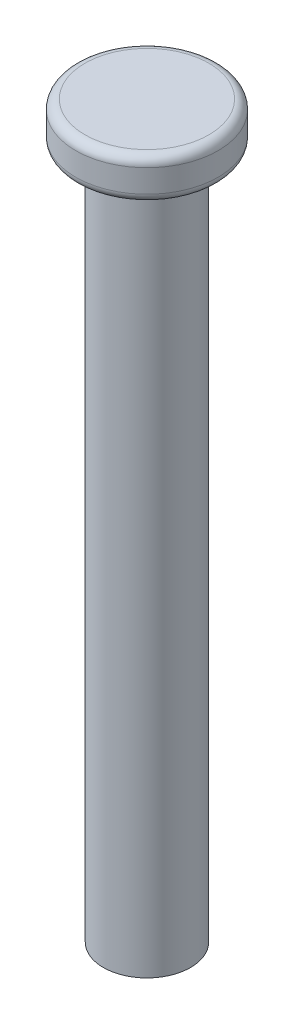
ISO-10303-21;
HEADER;
FILE_DESCRIPTION(('STEP AP214'),'2;1');
FILE_NAME('part.step','',(''),(''),'','','');
FILE_SCHEMA(('AUTOMOTIVE_DESIGN { 1 0 10303 214 1 1 1 1 }'));
ENDSEC;
DATA;
#1=APPLICATION_CONTEXT('core data for automotive mechanical design processes');
#2=APPLICATION_PROTOCOL_DEFINITION('international standard','automotive_design',2000,#1);
#3=PRODUCT_CONTEXT('',#1,'mechanical');
#4=PRODUCT('Part','Part','',(#3));
#5=PRODUCT_RELATED_PRODUCT_CATEGORY('part','',(#4));
#6=PRODUCT_DEFINITION_FORMATION('','',#4);
#7=PRODUCT_DEFINITION_CONTEXT('part definition',#1,'design');
#8=PRODUCT_DEFINITION('design','',#6,#7);
#9=PRODUCT_DEFINITION_SHAPE('','',#8);
#10=(LENGTH_UNIT() NAMED_UNIT(*) SI_UNIT(.MILLI.,.METRE.));
#11=(NAMED_UNIT(*) PLANE_ANGLE_UNIT() SI_UNIT($,.RADIAN.));
#12=(NAMED_UNIT(*) SI_UNIT($,.STERADIAN.) SOLID_ANGLE_UNIT());
#13=UNCERTAINTY_MEASURE_WITH_UNIT(LENGTH_MEASURE(1.E-05),#10,'distance_accuracy_value','');
#14=(GEOMETRIC_REPRESENTATION_CONTEXT(3) GLOBAL_UNCERTAINTY_ASSIGNED_CONTEXT((#13)) GLOBAL_UNIT_ASSIGNED_CONTEXT((#10,
#11,#12)) REPRESENTATION_CONTEXT('',''));
#15=CARTESIAN_POINT('',(0.,0.,0.));
#16=DIRECTION('',(0.,0.,1.));
#17=DIRECTION('',(1.,0.,0.));
#18=AXIS2_PLACEMENT_3D('',#15,#16,#17);
#19=CARTESIAN_POINT('',(0.,19.05,0.));
#20=DIRECTION('',(0.,-1.,0.));
#21=DIRECTION('',(0.,0.,-1.));
#22=AXIS2_PLACEMENT_3D('',#19,#20,#21);
#23=CYLINDRICAL_SURFACE('',#22,1.2065);
#24=CARTESIAN_POINT('',(0.,19.05,0.));
#25=DIRECTION('',(0.,1.,0.));
#26=DIRECTION('',(0.,0.,1.));
#27=AXIS2_PLACEMENT_3D('',#24,#25,#26);
#28=CIRCLE('',#27,1.2065);
#29=CARTESIAN_POINT('',(0.,19.05,-1.2065));
#30=VERTEX_POINT('',#29);
#31=EDGE_CURVE('E50',#30,#30,#28,.T.);
#32=CARTESIAN_POINT('',(0.,0.,0.));
#33=DIRECTION('',(0.,1.,0.));
#34=DIRECTION('',(0.,0.,1.));
#35=AXIS2_PLACEMENT_3D('',#32,#33,#34);
#36=CIRCLE('',#35,1.2065);
#37=CARTESIAN_POINT('',(0.,0.,-1.2065));
#38=VERTEX_POINT('',#37);
#39=EDGE_CURVE('E51',#38,#38,#36,.T.);
#40=CARTESIAN_POINT('',(0.,19.05,-1.2065));
#41=CARTESIAN_POINT('',(0.,18.8515625,-1.2065));
#42=CARTESIAN_POINT('',(0.,18.653125,-1.2065));
#43=CARTESIAN_POINT('',(0.,18.25625,-1.2065));
#44=CARTESIAN_POINT('',(0.,18.0578125,-1.2065));
#45=CARTESIAN_POINT('',(0.,17.6609375,-1.2065));
#46=CARTESIAN_POINT('',(0.,17.4625,-1.2065));
#47=CARTESIAN_POINT('',(0.,17.065625,-1.2065));
#48=CARTESIAN_POINT('',(0.,16.8671875,-1.2065));
#49=CARTESIAN_POINT('',(0.,16.4703125,-1.2065));
#50=CARTESIAN_POINT('',(0.,16.271875,-1.2065));
#51=CARTESIAN_POINT('',(0.,15.875,-1.2065));
#52=CARTESIAN_POINT('',(0.,15.6765625,-1.2065));
#53=CARTESIAN_POINT('',(0.,15.2796875,-1.2065));
#54=CARTESIAN_POINT('',(0.,15.08125,-1.2065));
#55=CARTESIAN_POINT('',(0.,14.684375,-1.2065));
#56=CARTESIAN_POINT('',(0.,14.4859375,-1.2065));
#57=CARTESIAN_POINT('',(0.,14.0890625,-1.2065));
#58=CARTESIAN_POINT('',(0.,13.890625,-1.2065));
#59=CARTESIAN_POINT('',(0.,13.49375,-1.2065));
#60=CARTESIAN_POINT('',(0.,13.2953125,-1.2065));
#61=CARTESIAN_POINT('',(0.,12.8984375,-1.2065));
#62=CARTESIAN_POINT('',(0.,12.7,-1.2065));
#63=CARTESIAN_POINT('',(0.,12.303125,-1.2065));
#64=CARTESIAN_POINT('',(0.,12.1046875,-1.2065));
#65=CARTESIAN_POINT('',(0.,11.7078125,-1.2065));
#66=CARTESIAN_POINT('',(0.,11.509375,-1.2065));
#67=CARTESIAN_POINT('',(0.,11.1125,-1.2065));
#68=CARTESIAN_POINT('',(0.,10.9140625,-1.2065));
#69=CARTESIAN_POINT('',(0.,10.5171875,-1.2065));
#70=CARTESIAN_POINT('',(0.,10.31875,-1.2065));
#71=CARTESIAN_POINT('',(0.,9.921875,-1.2065));
#72=CARTESIAN_POINT('',(0.,9.7234375,-1.2065));
#73=CARTESIAN_POINT('',(0.,9.3265625,-1.2065));
#74=CARTESIAN_POINT('',(0.,9.128125,-1.2065));
#75=CARTESIAN_POINT('',(0.,8.73125,-1.2065));
#76=CARTESIAN_POINT('',(0.,8.5328125,-1.2065));
#77=CARTESIAN_POINT('',(0.,8.1359375,-1.2065));
#78=CARTESIAN_POINT('',(0.,7.9375,-1.2065));
#79=CARTESIAN_POINT('',(0.,7.540625,-1.2065));
#80=CARTESIAN_POINT('',(0.,7.3421875,-1.2065));
#81=CARTESIAN_POINT('',(0.,6.9453125,-1.2065));
#82=CARTESIAN_POINT('',(0.,6.746875,-1.2065));
#83=CARTESIAN_POINT('',(0.,6.35,-1.2065));
#84=CARTESIAN_POINT('',(0.,6.1515625,-1.2065));
#85=CARTESIAN_POINT('',(0.,5.7546875,-1.2065));
#86=CARTESIAN_POINT('',(0.,5.55625,-1.2065));
#87=CARTESIAN_POINT('',(0.,5.159375,-1.2065));
#88=CARTESIAN_POINT('',(0.,4.9609375,-1.2065));
#89=CARTESIAN_POINT('',(0.,4.5640625,-1.2065));
#90=CARTESIAN_POINT('',(0.,4.365625,-1.2065));
#91=CARTESIAN_POINT('',(0.,3.96875,-1.2065));
#92=CARTESIAN_POINT('',(0.,3.7703125,-1.2065));
#93=CARTESIAN_POINT('',(0.,3.3734375,-1.2065));
#94=CARTESIAN_POINT('',(0.,3.175,-1.2065));
#95=CARTESIAN_POINT('',(0.,2.778125,-1.2065));
#96=CARTESIAN_POINT('',(0.,2.5796875,-1.2065));
#97=CARTESIAN_POINT('',(0.,2.1828125,-1.2065));
#98=CARTESIAN_POINT('',(0.,1.984375,-1.2065));
#99=CARTESIAN_POINT('',(0.,1.5875,-1.2065));
#100=CARTESIAN_POINT('',(0.,1.3890625,-1.2065));
#101=CARTESIAN_POINT('',(0.,0.992187500000001,-1.2065));
#102=CARTESIAN_POINT('',(0.,0.793750000000001,-1.2065));
#103=CARTESIAN_POINT('',(0.,0.396875,-1.2065));
#104=CARTESIAN_POINT('',(0.,0.1984375,-1.2065));
#105=CARTESIAN_POINT('',(0.,0.,-1.2065));
#106=B_SPLINE_CURVE_WITH_KNOTS('',3,(#40,#41,#42,#43,#44,#45,#46,#47,#48,#49,#50,#51,#52,#53,
#54,#55,#56,#57,#58,#59,#60,#61,#62,#63,#64,#65,#66,#67,#68,#69,#70,#71,#72,#73,#74,#75,#76,#77,
#78,#79,#80,#81,#82,#83,#84,#85,#86,#87,#88,#89,#90,#91,#92,#93,#94,#95,#96,#97,#98,#99,#100,
#101,#102,#103,#104,#105),.UNSPECIFIED.,.F.,.F.,(4,2,2,2,2,2,2,2,2,2,2,2,2,2,2,2,2,2,2,2,2,2,2,
2,2,2,2,2,2,2,2,2,4),(0.,0.5953125,1.190625,1.7859375,2.38125,2.9765625,3.571875,4.1671875,
4.7625,5.3578125,5.953125,6.5484375,7.14375,7.7390625,8.334375,8.9296875,9.525,10.1203125,
10.715625,11.3109375,11.90625,12.5015625,13.096875,13.6921875,14.2875,14.8828125,15.478125,
16.0734375,16.66875,17.2640625,17.859375,18.4546875,19.05),.UNSPECIFIED.);
#107=EDGE_CURVE('BSEAM30',#30,#38,#106,.T.);
#108=ORIENTED_EDGE('',*,*,#31,.F.);
#109=ORIENTED_EDGE('',*,*,#39,.T.);
#110=ORIENTED_EDGE('',*,*,#107,.T.);
#111=ORIENTED_EDGE('',*,*,#107,.F.);
#112=EDGE_LOOP('',(#108,#110,#109,#111));
#113=FACE_BOUND('',#112,.T.);
#114=ADVANCED_FACE('F30',(#113),#23,.T.);
#115=CARTESIAN_POINT('',(0.,0.,0.));
#116=DIRECTION('',(0.,1.,0.));
#117=DIRECTION('',(0.,0.,1.));
#118=AXIS2_PLACEMENT_3D('',#115,#116,#117);
#119=PLANE('',#118);
#120=ORIENTED_EDGE('',*,*,#39,.F.);
#121=EDGE_LOOP('',(#120));
#122=FACE_BOUND('',#121,.T.);
#123=ADVANCED_FACE('F61',(#122),#119,.F.);
#124=CARTESIAN_POINT('',(0.,19.05,0.));
#125=DIRECTION('',(0.,1.,0.));
#126=DIRECTION('',(0.,0.,1.));
#127=AXIS2_PLACEMENT_3D('',#124,#125,#126);
#128=PLANE('',#127);
#129=CARTESIAN_POINT('',(0.,19.05,0.));
#130=DIRECTION('',(0.,1.,0.));
#131=DIRECTION('',(0.,0.,1.));
#132=AXIS2_PLACEMENT_3D('',#129,#130,#131);
#133=CIRCLE('',#132,1.7145);
#134=CARTESIAN_POINT('',(0.,19.05,1.7145));
#135=VERTEX_POINT('',#134);
#136=EDGE_CURVE('E37',#135,#135,#133,.F.);
#137=ORIENTED_EDGE('',*,*,#136,.T.);
#138=EDGE_LOOP('',(#137));
#139=FACE_BOUND('',#138,.T.);
#140=ORIENTED_EDGE('',*,*,#31,.T.);
#141=EDGE_LOOP('',(#140));
#142=FACE_BOUND('',#141,.T.);
#143=ADVANCED_FACE('F57',(#139,#142),#128,.F.);
#144=CARTESIAN_POINT('',(0.,20.193,0.));
#145=DIRECTION('',(0.,-1.,0.));
#146=DIRECTION('',(0.,0.,-1.));
#147=AXIS2_PLACEMENT_3D('',#144,#145,#146);
#148=CYLINDRICAL_SURFACE('',#147,1.9685);
#149=CARTESIAN_POINT('',(0.,19.304,0.));
#150=DIRECTION('',(0.,1.,0.));
#151=DIRECTION('',(0.,0.,1.));
#152=AXIS2_PLACEMENT_3D('',#149,#150,#151);
#153=CIRCLE('',#152,1.9685);
#154=CARTESIAN_POINT('',(0.,19.304,1.9685));
#155=VERTEX_POINT('',#154);
#156=EDGE_CURVE('E41',#155,#155,#153,.T.);
#157=ORIENTED_EDGE('',*,*,#156,.T.);
#158=EDGE_LOOP('',(#157));
#159=FACE_BOUND('',#158,.T.);
#160=CARTESIAN_POINT('',(0.,19.939,0.));
#161=DIRECTION('',(0.,1.,0.));
#162=DIRECTION('',(0.,0.,1.));
#163=AXIS2_PLACEMENT_3D('',#160,#161,#162);
#164=CIRCLE('',#163,1.9685);
#165=CARTESIAN_POINT('',(0.,19.939,1.9685));
#166=VERTEX_POINT('',#165);
#167=EDGE_CURVE('E45',#166,#166,#164,.F.);
#168=ORIENTED_EDGE('',*,*,#167,.T.);
#169=EDGE_LOOP('',(#168));
#170=FACE_BOUND('',#169,.T.);
#171=ADVANCED_FACE('F70',(#159,#170),#148,.T.);
#172=CARTESIAN_POINT('',(0.,20.193,0.));
#173=DIRECTION('',(0.,1.,0.));
#174=DIRECTION('',(0.,0.,1.));
#175=AXIS2_PLACEMENT_3D('',#172,#173,#174);
#176=PLANE('',#175);
#177=CARTESIAN_POINT('',(0.,20.193,0.));
#178=DIRECTION('',(0.,1.,0.));
#179=DIRECTION('',(0.,0.,1.));
#180=AXIS2_PLACEMENT_3D('',#177,#178,#179);
#181=CIRCLE('',#180,1.7145);
#182=CARTESIAN_POINT('',(0.,20.193,1.7145));
#183=VERTEX_POINT('',#182);
#184=EDGE_CURVE('E10',#183,#183,#181,.T.);
#185=ORIENTED_EDGE('',*,*,#184,.T.);
#186=EDGE_LOOP('',(#185));
#187=FACE_BOUND('',#186,.T.);
#188=ADVANCED_FACE('F75',(#187),#176,.T.);
#189=CARTESIAN_POINT('',(0.,19.304,0.));
#190=DIRECTION('',(0.,1.,0.));
#191=DIRECTION('',(0.,0.,1.));
#192=AXIS2_PLACEMENT_3D('',#189,#190,#191);
#193=TOROIDAL_SURFACE('',#192,1.7145,0.254);
#194=ORIENTED_EDGE('',*,*,#136,.F.);
#195=EDGE_LOOP('',(#194));
#196=FACE_BOUND('',#195,.T.);
#197=ORIENTED_EDGE('',*,*,#156,.F.);
#198=EDGE_LOOP('',(#197));
#199=FACE_BOUND('',#198,.T.);
#200=ADVANCED_FACE('F73',(#196,#199),#193,.T.);
#201=CARTESIAN_POINT('',(0.,19.939,0.));
#202=DIRECTION('',(0.,1.,0.));
#203=DIRECTION('',(0.,0.,1.));
#204=AXIS2_PLACEMENT_3D('',#201,#202,#203);
#205=TOROIDAL_SURFACE('',#204,1.7145,0.254);
#206=ORIENTED_EDGE('',*,*,#167,.F.);
#207=EDGE_LOOP('',(#206));
#208=FACE_BOUND('',#207,.T.);
#209=ORIENTED_EDGE('',*,*,#184,.F.);
#210=EDGE_LOOP('',(#209));
#211=FACE_BOUND('',#210,.T.);
#212=ADVANCED_FACE('F32',(#208,#211),#205,.T.);
#213=CLOSED_SHELL('',(#114,#123,#143,#171,#188,#200,#212));
#214=MANIFOLD_SOLID_BREP('B2',#213);
#215=ADVANCED_BREP_SHAPE_REPRESENTATION('',(#18,#214),#14);
#216=SHAPE_DEFINITION_REPRESENTATION(#9,#215);
ENDSEC;
END-ISO-10303-21;
